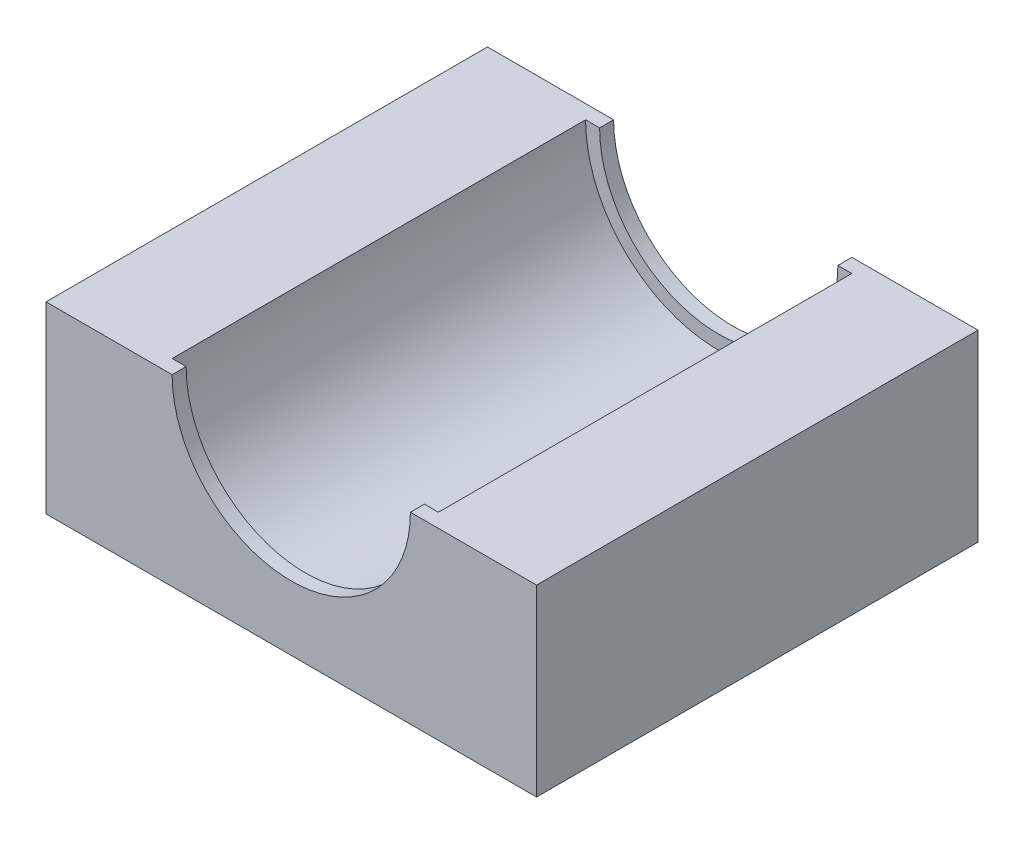
ISO-10303-21;
HEADER;
FILE_DESCRIPTION(('STEP AP214'),'2;1');
FILE_NAME('part.step','',(''),(''),'','','');
FILE_SCHEMA(('AUTOMOTIVE_DESIGN { 1 0 10303 214 1 1 1 1 }'));
ENDSEC;
DATA;
#1=APPLICATION_CONTEXT('core data for automotive mechanical design processes');
#2=APPLICATION_PROTOCOL_DEFINITION('international standard','automotive_design',2000,#1);
#3=PRODUCT_CONTEXT('',#1,'mechanical');
#4=PRODUCT('Part','Part','',(#3));
#5=PRODUCT_RELATED_PRODUCT_CATEGORY('part','',(#4));
#6=PRODUCT_DEFINITION_FORMATION('','',#4);
#7=PRODUCT_DEFINITION_CONTEXT('part definition',#1,'design');
#8=PRODUCT_DEFINITION('design','',#6,#7);
#9=PRODUCT_DEFINITION_SHAPE('','',#8);
#10=(LENGTH_UNIT() NAMED_UNIT(*) SI_UNIT(.MILLI.,.METRE.));
#11=(NAMED_UNIT(*) PLANE_ANGLE_UNIT() SI_UNIT($,.RADIAN.));
#12=(NAMED_UNIT(*) SI_UNIT($,.STERADIAN.) SOLID_ANGLE_UNIT());
#13=UNCERTAINTY_MEASURE_WITH_UNIT(LENGTH_MEASURE(1.E-05),#10,'distance_accuracy_value','');
#14=(GEOMETRIC_REPRESENTATION_CONTEXT(3) GLOBAL_UNCERTAINTY_ASSIGNED_CONTEXT((#13)) GLOBAL_UNIT_ASSIGNED_CONTEXT((#10,
#11,#12)) REPRESENTATION_CONTEXT('',''));
#15=CARTESIAN_POINT('',(0.,0.,0.));
#16=DIRECTION('',(0.,0.,1.));
#17=DIRECTION('',(1.,0.,0.));
#18=AXIS2_PLACEMENT_3D('',#15,#16,#17);
#19=CARTESIAN_POINT('',(35.,26.2,63.));
#20=DIRECTION('',(0.,0.,-1.));
#21=DIRECTION('',(-1.,0.,0.));
#22=AXIS2_PLACEMENT_3D('',#19,#20,#21);
#23=CYLINDRICAL_SURFACE('',#22,19.);
#24=DIRECTION('',(0.,0.,-1.));
#25=VECTOR('',#24,1.);
#26=CARTESIAN_POINT('',(54.,26.2,63.));
#27=LINE('',#26,#25);
#28=CARTESIAN_POINT('',(54.,26.2,61.));
#29=VERTEX_POINT('',#28);
#30=CARTESIAN_POINT('',(54.,26.2,2.));
#31=VERTEX_POINT('',#30);
#32=EDGE_CURVE('E127',#29,#31,#27,.T.);
#33=ORIENTED_EDGE('',*,*,#32,.T.);
#34=CARTESIAN_POINT('',(35.,26.2,2.));
#35=DIRECTION('',(0.,0.,1.));
#36=DIRECTION('',(1.,0.,0.));
#37=AXIS2_PLACEMENT_3D('',#34,#35,#36);
#38=CIRCLE('',#37,19.);
#39=CARTESIAN_POINT('',(16.,26.2,2.));
#40=VERTEX_POINT('',#39);
#41=EDGE_CURVE('E119',#40,#31,#38,.T.);
#42=ORIENTED_EDGE('',*,*,#41,.F.);
#43=DIRECTION('',(0.,0.,-1.));
#44=VECTOR('',#43,1.);
#45=CARTESIAN_POINT('',(16.,26.2,63.));
#46=LINE('',#45,#44);
#47=CARTESIAN_POINT('',(16.,26.2,61.));
#48=VERTEX_POINT('',#47);
#49=EDGE_CURVE('E60',#48,#40,#46,.T.);
#50=ORIENTED_EDGE('',*,*,#49,.F.);
#51=CARTESIAN_POINT('',(35.,26.2,61.));
#52=DIRECTION('',(0.,0.,1.));
#53=DIRECTION('',(1.,0.,0.));
#54=AXIS2_PLACEMENT_3D('',#51,#52,#53);
#55=CIRCLE('',#54,19.);
#56=EDGE_CURVE('E55',#48,#29,#55,.T.);
#57=ORIENTED_EDGE('',*,*,#56,.T.);
#58=EDGE_LOOP('',(#33,#42,#50,#57));
#59=FACE_BOUND('',#58,.T.);
#60=ADVANCED_FACE('F39',(#59),#23,.F.);
#61=CARTESIAN_POINT('',(16.,26.2,63.));
#62=DIRECTION('',(0.,-1.,0.));
#63=DIRECTION('',(1.,0.,0.));
#64=AXIS2_PLACEMENT_3D('',#61,#62,#63);
#65=PLANE('',#64);
#66=DIRECTION('',(-1.,0.,0.));
#67=VECTOR('',#66,1.);
#68=CARTESIAN_POINT('',(16.,26.2,0.));
#69=LINE('',#68,#67);
#70=CARTESIAN_POINT('',(18.,26.2,0.));
#71=VERTEX_POINT('',#70);
#72=CARTESIAN_POINT('',(0.,26.2,0.));
#73=VERTEX_POINT('',#72);
#74=EDGE_CURVE('E175',#71,#73,#69,.T.);
#75=ORIENTED_EDGE('',*,*,#74,.T.);
#76=DIRECTION('',(0.,0.,-1.));
#77=VECTOR('',#76,1.);
#78=CARTESIAN_POINT('',(0.,26.2,63.));
#79=LINE('',#78,#77);
#80=CARTESIAN_POINT('',(0.,26.2,63.));
#81=VERTEX_POINT('',#80);
#82=EDGE_CURVE('E11',#81,#73,#79,.T.);
#83=ORIENTED_EDGE('',*,*,#82,.F.);
#84=DIRECTION('',(-1.,0.,0.));
#85=VECTOR('',#84,1.);
#86=CARTESIAN_POINT('',(16.,26.2,63.));
#87=LINE('',#86,#85);
#88=CARTESIAN_POINT('',(18.,26.2,63.));
#89=VERTEX_POINT('',#88);
#90=EDGE_CURVE('E188',#89,#81,#87,.T.);
#91=ORIENTED_EDGE('',*,*,#90,.F.);
#92=DIRECTION('',(0.,0.,1.));
#93=VECTOR('',#92,1.);
#94=CARTESIAN_POINT('',(18.,26.2,61.));
#95=LINE('',#94,#93);
#96=CARTESIAN_POINT('',(18.,26.2,61.));
#97=VERTEX_POINT('',#96);
#98=EDGE_CURVE('E179',#97,#89,#95,.T.);
#99=ORIENTED_EDGE('',*,*,#98,.F.);
#100=DIRECTION('',(-1.,0.,0.));
#101=VECTOR('',#100,1.);
#102=CARTESIAN_POINT('',(18.,26.2,61.));
#103=LINE('',#102,#101);
#104=EDGE_CURVE('E134',#97,#48,#103,.T.);
#105=ORIENTED_EDGE('',*,*,#104,.T.);
#106=ORIENTED_EDGE('',*,*,#49,.T.);
#107=DIRECTION('',(-1.,0.,0.));
#108=VECTOR('',#107,1.);
#109=CARTESIAN_POINT('',(18.,26.2,2.));
#110=LINE('',#109,#108);
#111=CARTESIAN_POINT('',(18.,26.2,2.));
#112=VERTEX_POINT('',#111);
#113=EDGE_CURVE('E117',#112,#40,#110,.T.);
#114=ORIENTED_EDGE('',*,*,#113,.F.);
#115=DIRECTION('',(0.,0.,-1.));
#116=VECTOR('',#115,1.);
#117=CARTESIAN_POINT('',(18.,26.2,2.));
#118=LINE('',#117,#116);
#119=EDGE_CURVE('E216',#112,#71,#118,.T.);
#120=ORIENTED_EDGE('',*,*,#119,.T.);
#121=EDGE_LOOP('',(#75,#83,#91,#99,#105,#106,#114,#120));
#122=FACE_BOUND('',#121,.T.);
#123=ADVANCED_FACE('F41',(#122),#65,.F.);
#124=CARTESIAN_POINT('',(0.,26.2,63.));
#125=DIRECTION('',(1.,0.,0.));
#126=DIRECTION('',(0.,1.,0.));
#127=AXIS2_PLACEMENT_3D('',#124,#125,#126);
#128=PLANE('',#127);
#129=DIRECTION('',(0.,-1.,0.));
#130=VECTOR('',#129,1.);
#131=CARTESIAN_POINT('',(0.,26.2,0.));
#132=LINE('',#131,#130);
#133=CARTESIAN_POINT('',(0.,0.,0.));
#134=VERTEX_POINT('',#133);
#135=EDGE_CURVE('E168',#73,#134,#132,.T.);
#136=ORIENTED_EDGE('',*,*,#135,.T.);
#137=DIRECTION('',(0.,0.,-1.));
#138=VECTOR('',#137,1.);
#139=CARTESIAN_POINT('',(0.,0.,63.));
#140=LINE('',#139,#138);
#141=CARTESIAN_POINT('',(0.,0.,63.));
#142=VERTEX_POINT('',#141);
#143=EDGE_CURVE('E48',#142,#134,#140,.T.);
#144=ORIENTED_EDGE('',*,*,#143,.F.);
#145=DIRECTION('',(0.,-1.,0.));
#146=VECTOR('',#145,1.);
#147=CARTESIAN_POINT('',(0.,26.2,63.));
#148=LINE('',#147,#146);
#149=EDGE_CURVE('E185',#81,#142,#148,.T.);
#150=ORIENTED_EDGE('',*,*,#149,.F.);
#151=ORIENTED_EDGE('',*,*,#82,.T.);
#152=EDGE_LOOP('',(#136,#144,#150,#151));
#153=FACE_BOUND('',#152,.T.);
#154=ADVANCED_FACE('F237',(#153),#128,.F.);
#155=CARTESIAN_POINT('',(0.,0.,63.));
#156=DIRECTION('',(0.,1.,0.));
#157=DIRECTION('',(0.,0.,1.));
#158=AXIS2_PLACEMENT_3D('',#155,#156,#157);
#159=PLANE('',#158);
#160=DIRECTION('',(1.,0.,0.));
#161=VECTOR('',#160,1.);
#162=CARTESIAN_POINT('',(0.,0.,0.));
#163=LINE('',#162,#161);
#164=CARTESIAN_POINT('',(70.,0.,0.));
#165=VERTEX_POINT('',#164);
#166=EDGE_CURVE('E162',#134,#165,#163,.T.);
#167=ORIENTED_EDGE('',*,*,#166,.T.);
#168=DIRECTION('',(0.,0.,-1.));
#169=VECTOR('',#168,1.);
#170=CARTESIAN_POINT('',(70.,0.,63.));
#171=LINE('',#170,#169);
#172=CARTESIAN_POINT('',(70.,0.,63.));
#173=VERTEX_POINT('',#172);
#174=EDGE_CURVE('E151',#173,#165,#171,.T.);
#175=ORIENTED_EDGE('',*,*,#174,.F.);
#176=DIRECTION('',(1.,0.,0.));
#177=VECTOR('',#176,1.);
#178=CARTESIAN_POINT('',(0.,0.,63.));
#179=LINE('',#178,#177);
#180=EDGE_CURVE('E163',#142,#173,#179,.T.);
#181=ORIENTED_EDGE('',*,*,#180,.F.);
#182=ORIENTED_EDGE('',*,*,#143,.T.);
#183=EDGE_LOOP('',(#167,#175,#181,#182));
#184=FACE_BOUND('',#183,.T.);
#185=ADVANCED_FACE('F160',(#184),#159,.F.);
#186=CARTESIAN_POINT('',(70.,0.,63.));
#187=DIRECTION('',(-1.,0.,0.));
#188=DIRECTION('',(0.,0.,1.));
#189=AXIS2_PLACEMENT_3D('',#186,#187,#188);
#190=PLANE('',#189);
#191=DIRECTION('',(0.,1.,0.));
#192=VECTOR('',#191,1.);
#193=CARTESIAN_POINT('',(70.,0.,0.));
#194=LINE('',#193,#192);
#195=CARTESIAN_POINT('',(70.,26.2,0.));
#196=VERTEX_POINT('',#195);
#197=EDGE_CURVE('E170',#165,#196,#194,.T.);
#198=ORIENTED_EDGE('',*,*,#197,.T.);
#199=DIRECTION('',(0.,0.,-1.));
#200=VECTOR('',#199,1.);
#201=CARTESIAN_POINT('',(70.,26.2,63.));
#202=LINE('',#201,#200);
#203=CARTESIAN_POINT('',(70.,26.2,63.));
#204=VERTEX_POINT('',#203);
#205=EDGE_CURVE('E140',#204,#196,#202,.T.);
#206=ORIENTED_EDGE('',*,*,#205,.F.);
#207=DIRECTION('',(0.,1.,0.));
#208=VECTOR('',#207,1.);
#209=CARTESIAN_POINT('',(70.,0.,63.));
#210=LINE('',#209,#208);
#211=EDGE_CURVE('E142',#173,#204,#210,.T.);
#212=ORIENTED_EDGE('',*,*,#211,.F.);
#213=ORIENTED_EDGE('',*,*,#174,.T.);
#214=EDGE_LOOP('',(#198,#206,#212,#213));
#215=FACE_BOUND('',#214,.T.);
#216=ADVANCED_FACE('F251',(#215),#190,.F.);
#217=CARTESIAN_POINT('',(70.,26.2,63.));
#218=DIRECTION('',(0.,-1.,0.));
#219=DIRECTION('',(0.,0.,-1.));
#220=AXIS2_PLACEMENT_3D('',#217,#218,#219);
#221=PLANE('',#220);
#222=DIRECTION('',(-1.,0.,0.));
#223=VECTOR('',#222,1.);
#224=CARTESIAN_POINT('',(70.,26.2,0.));
#225=LINE('',#224,#223);
#226=CARTESIAN_POINT('',(52.,26.2,0.));
#227=VERTEX_POINT('',#226);
#228=EDGE_CURVE('E145',#196,#227,#225,.T.);
#229=ORIENTED_EDGE('',*,*,#228,.T.);
#230=DIRECTION('',(0.,0.,-1.));
#231=VECTOR('',#230,1.);
#232=CARTESIAN_POINT('',(52.,26.2,2.));
#233=LINE('',#232,#231);
#234=CARTESIAN_POINT('',(52.,26.2,2.));
#235=VERTEX_POINT('',#234);
#236=EDGE_CURVE('E203',#235,#227,#233,.T.);
#237=ORIENTED_EDGE('',*,*,#236,.F.);
#238=DIRECTION('',(-1.,0.,0.));
#239=VECTOR('',#238,1.);
#240=CARTESIAN_POINT('',(52.,26.2,2.));
#241=LINE('',#240,#239);
#242=EDGE_CURVE('E219',#31,#235,#241,.T.);
#243=ORIENTED_EDGE('',*,*,#242,.F.);
#244=ORIENTED_EDGE('',*,*,#32,.F.);
#245=DIRECTION('',(-1.,0.,0.));
#246=VECTOR('',#245,1.);
#247=CARTESIAN_POINT('',(52.,26.2,61.));
#248=LINE('',#247,#246);
#249=CARTESIAN_POINT('',(52.,26.2,61.));
#250=VERTEX_POINT('',#249);
#251=EDGE_CURVE('E210',#29,#250,#248,.T.);
#252=ORIENTED_EDGE('',*,*,#251,.T.);
#253=DIRECTION('',(0.,0.,1.));
#254=VECTOR('',#253,1.);
#255=CARTESIAN_POINT('',(52.,26.2,61.));
#256=LINE('',#255,#254);
#257=CARTESIAN_POINT('',(52.,26.2,63.));
#258=VERTEX_POINT('',#257);
#259=EDGE_CURVE('E192',#250,#258,#256,.T.);
#260=ORIENTED_EDGE('',*,*,#259,.T.);
#261=DIRECTION('',(-1.,0.,0.));
#262=VECTOR('',#261,1.);
#263=CARTESIAN_POINT('',(70.,26.2,63.));
#264=LINE('',#263,#262);
#265=EDGE_CURVE('E136',#204,#258,#264,.T.);
#266=ORIENTED_EDGE('',*,*,#265,.F.);
#267=ORIENTED_EDGE('',*,*,#205,.T.);
#268=EDGE_LOOP('',(#229,#237,#243,#244,#252,#260,#266,#267));
#269=FACE_BOUND('',#268,.T.);
#270=ADVANCED_FACE('F231',(#269),#221,.F.);
#271=CARTESIAN_POINT('',(35.,26.2,63.));
#272=DIRECTION('',(0.,0.,1.));
#273=DIRECTION('',(1.,0.,0.));
#274=AXIS2_PLACEMENT_3D('',#271,#272,#273);
#275=PLANE('',#274);
#276=ORIENTED_EDGE('',*,*,#90,.T.);
#277=ORIENTED_EDGE('',*,*,#149,.T.);
#278=ORIENTED_EDGE('',*,*,#180,.T.);
#279=ORIENTED_EDGE('',*,*,#211,.T.);
#280=ORIENTED_EDGE('',*,*,#265,.T.);
#281=CARTESIAN_POINT('',(35.,26.2,63.));
#282=DIRECTION('',(0.,0.,-1.));
#283=DIRECTION('',(1.,0.,0.));
#284=AXIS2_PLACEMENT_3D('',#281,#282,#283);
#285=CIRCLE('',#284,17.);
#286=EDGE_CURVE('E199',#258,#89,#285,.T.);
#287=ORIENTED_EDGE('',*,*,#286,.T.);
#288=EDGE_LOOP('',(#276,#277,#278,#279,#280,#287));
#289=FACE_BOUND('',#288,.T.);
#290=ADVANCED_FACE('F239',(#289),#275,.T.);
#291=CARTESIAN_POINT('',(35.,26.2,0.));
#292=DIRECTION('',(0.,0.,1.));
#293=DIRECTION('',(1.,0.,0.));
#294=AXIS2_PLACEMENT_3D('',#291,#292,#293);
#295=PLANE('',#294);
#296=ORIENTED_EDGE('',*,*,#74,.F.);
#297=CARTESIAN_POINT('',(35.,26.2,0.));
#298=DIRECTION('',(0.,0.,-1.));
#299=DIRECTION('',(1.,0.,0.));
#300=AXIS2_PLACEMENT_3D('',#297,#298,#299);
#301=CIRCLE('',#300,17.);
#302=EDGE_CURVE('E129',#227,#71,#301,.T.);
#303=ORIENTED_EDGE('',*,*,#302,.F.);
#304=ORIENTED_EDGE('',*,*,#228,.F.);
#305=ORIENTED_EDGE('',*,*,#197,.F.);
#306=ORIENTED_EDGE('',*,*,#166,.F.);
#307=ORIENTED_EDGE('',*,*,#135,.F.);
#308=EDGE_LOOP('',(#296,#303,#304,#305,#306,#307));
#309=FACE_BOUND('',#308,.T.);
#310=ADVANCED_FACE('F167',(#309),#295,.F.);
#311=CARTESIAN_POINT('',(35.,26.2,61.));
#312=DIRECTION('',(0.,0.,1.));
#313=DIRECTION('',(1.,0.,0.));
#314=AXIS2_PLACEMENT_3D('',#311,#312,#313);
#315=CYLINDRICAL_SURFACE('',#314,17.);
#316=ORIENTED_EDGE('',*,*,#286,.F.);
#317=ORIENTED_EDGE('',*,*,#259,.F.);
#318=CARTESIAN_POINT('',(35.,26.2,61.));
#319=DIRECTION('',(0.,0.,-1.));
#320=DIRECTION('',(1.,0.,0.));
#321=AXIS2_PLACEMENT_3D('',#318,#319,#320);
#322=CIRCLE('',#321,17.);
#323=EDGE_CURVE('E206',#250,#97,#322,.T.);
#324=ORIENTED_EDGE('',*,*,#323,.T.);
#325=ORIENTED_EDGE('',*,*,#98,.T.);
#326=EDGE_LOOP('',(#316,#317,#324,#325));
#327=FACE_BOUND('',#326,.T.);
#328=ADVANCED_FACE('F243',(#327),#315,.F.);
#329=CARTESIAN_POINT('',(35.,26.2,61.));
#330=DIRECTION('',(0.,0.,1.));
#331=DIRECTION('',(1.,0.,0.));
#332=AXIS2_PLACEMENT_3D('',#329,#330,#331);
#333=PLANE('',#332);
#334=ORIENTED_EDGE('',*,*,#56,.F.);
#335=ORIENTED_EDGE('',*,*,#104,.F.);
#336=ORIENTED_EDGE('',*,*,#323,.F.);
#337=ORIENTED_EDGE('',*,*,#251,.F.);
#338=EDGE_LOOP('',(#334,#335,#336,#337));
#339=FACE_BOUND('',#338,.T.);
#340=ADVANCED_FACE('F247',(#339),#333,.F.);
#341=CARTESIAN_POINT('',(35.,26.2,2.));
#342=DIRECTION('',(0.,0.,-1.));
#343=DIRECTION('',(-1.,0.,0.));
#344=AXIS2_PLACEMENT_3D('',#341,#342,#343);
#345=CYLINDRICAL_SURFACE('',#344,17.);
#346=ORIENTED_EDGE('',*,*,#302,.T.);
#347=ORIENTED_EDGE('',*,*,#119,.F.);
#348=CARTESIAN_POINT('',(35.,26.2,2.));
#349=DIRECTION('',(0.,0.,-1.));
#350=DIRECTION('',(1.,0.,0.));
#351=AXIS2_PLACEMENT_3D('',#348,#349,#350);
#352=CIRCLE('',#351,17.);
#353=EDGE_CURVE('E121',#235,#112,#352,.T.);
#354=ORIENTED_EDGE('',*,*,#353,.F.);
#355=ORIENTED_EDGE('',*,*,#236,.T.);
#356=EDGE_LOOP('',(#346,#347,#354,#355));
#357=FACE_BOUND('',#356,.T.);
#358=ADVANCED_FACE('F234',(#357),#345,.F.);
#359=CARTESIAN_POINT('',(35.,26.2,2.));
#360=DIRECTION('',(0.,0.,-1.));
#361=DIRECTION('',(1.,0.,0.));
#362=AXIS2_PLACEMENT_3D('',#359,#360,#361);
#363=PLANE('',#362);
#364=ORIENTED_EDGE('',*,*,#41,.T.);
#365=ORIENTED_EDGE('',*,*,#242,.T.);
#366=ORIENTED_EDGE('',*,*,#353,.T.);
#367=ORIENTED_EDGE('',*,*,#113,.T.);
#368=EDGE_LOOP('',(#364,#365,#366,#367));
#369=FACE_BOUND('',#368,.T.);
#370=ADVANCED_FACE('F118',(#369),#363,.F.);
#371=CLOSED_SHELL('',(#60,#123,#154,#185,#216,#270,#290,#310,#328,#340,#358,#370));
#372=MANIFOLD_SOLID_BREP('B2',#371);
#373=ADVANCED_BREP_SHAPE_REPRESENTATION('',(#18,#372),#14);
#374=SHAPE_DEFINITION_REPRESENTATION(#9,#373);
ENDSEC;
END-ISO-10303-21;
